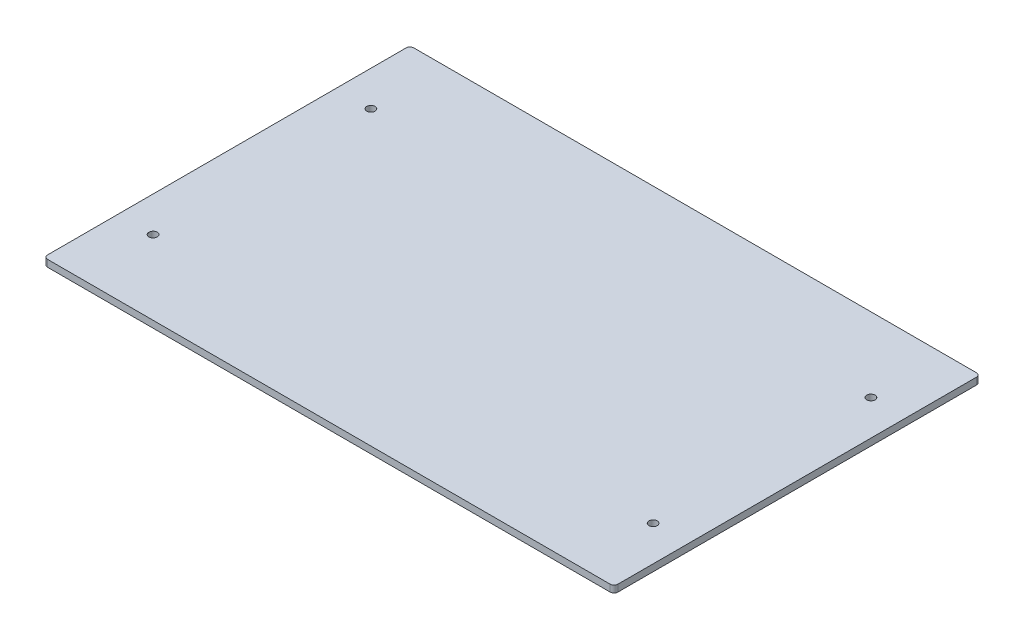
ISO-10303-21;
HEADER;
FILE_DESCRIPTION(('STEP AP214'),'2;1');
FILE_NAME('part.step','',(''),(''),'','','');
FILE_SCHEMA(('AUTOMOTIVE_DESIGN { 1 0 10303 214 1 1 1 1 }'));
ENDSEC;
DATA;
#1=APPLICATION_CONTEXT('core data for automotive mechanical design processes');
#2=APPLICATION_PROTOCOL_DEFINITION('international standard','automotive_design',2000,#1);
#3=PRODUCT_CONTEXT('',#1,'mechanical');
#4=PRODUCT('Part','Part','',(#3));
#5=PRODUCT_RELATED_PRODUCT_CATEGORY('part','',(#4));
#6=PRODUCT_DEFINITION_FORMATION('','',#4);
#7=PRODUCT_DEFINITION_CONTEXT('part definition',#1,'design');
#8=PRODUCT_DEFINITION('design','',#6,#7);
#9=PRODUCT_DEFINITION_SHAPE('','',#8);
#10=(LENGTH_UNIT() NAMED_UNIT(*) SI_UNIT(.MILLI.,.METRE.));
#11=(NAMED_UNIT(*) PLANE_ANGLE_UNIT() SI_UNIT($,.RADIAN.));
#12=(NAMED_UNIT(*) SI_UNIT($,.STERADIAN.) SOLID_ANGLE_UNIT());
#13=UNCERTAINTY_MEASURE_WITH_UNIT(LENGTH_MEASURE(1.E-05),#10,'distance_accuracy_value','');
#14=(GEOMETRIC_REPRESENTATION_CONTEXT(3) GLOBAL_UNCERTAINTY_ASSIGNED_CONTEXT((#13)) GLOBAL_UNIT_ASSIGNED_CONTEXT((#10,
#11,#12)) REPRESENTATION_CONTEXT('',''));
#15=CARTESIAN_POINT('',(0.,0.,0.));
#16=DIRECTION('',(0.,0.,1.));
#17=DIRECTION('',(1.,0.,0.));
#18=AXIS2_PLACEMENT_3D('',#15,#16,#17);
#19=CARTESIAN_POINT('',(0.,5.588,0.));
#20=DIRECTION('',(0.,-1.,0.));
#21=DIRECTION('',(0.,0.,-1.));
#22=AXIS2_PLACEMENT_3D('',#19,#20,#21);
#23=PLANE('',#22);
#24=DIRECTION('',(-1.,0.,0.));
#25=VECTOR('',#24,1.);
#26=CARTESIAN_POINT('',(0.,5.588,-297.688));
#27=LINE('',#26,#25);
#28=CARTESIAN_POINT('',(460.375,5.588,-297.688));
#29=VERTEX_POINT('',#28);
#30=CARTESIAN_POINT('',(3.175,5.588,-297.688));
#31=VERTEX_POINT('',#30);
#32=EDGE_CURVE('E138',#29,#31,#27,.T.);
#33=ORIENTED_EDGE('',*,*,#32,.T.);
#34=CARTESIAN_POINT('',(3.175,5.588,-294.513));
#35=DIRECTION('',(0.,-1.,0.));
#36=DIRECTION('',(0.,0.,-1.));
#37=AXIS2_PLACEMENT_3D('',#34,#35,#36);
#38=CIRCLE('',#37,3.175);
#39=CARTESIAN_POINT('',(0.,5.588,-294.513));
#40=VERTEX_POINT('',#39);
#41=EDGE_CURVE('E156',#31,#40,#38,.F.);
#42=ORIENTED_EDGE('',*,*,#41,.T.);
#43=DIRECTION('',(0.,0.,1.));
#44=VECTOR('',#43,1.);
#45=CARTESIAN_POINT('',(0.,5.588,0.));
#46=LINE('',#45,#44);
#47=CARTESIAN_POINT('',(0.,5.588,-3.175));
#48=VERTEX_POINT('',#47);
#49=EDGE_CURVE('E120',#40,#48,#46,.T.);
#50=ORIENTED_EDGE('',*,*,#49,.T.);
#51=CARTESIAN_POINT('',(3.175,5.588,-3.175));
#52=DIRECTION('',(0.,-1.,0.));
#53=DIRECTION('',(0.,0.,-1.));
#54=AXIS2_PLACEMENT_3D('',#51,#52,#53);
#55=CIRCLE('',#54,3.175);
#56=CARTESIAN_POINT('',(3.175,5.588,0.));
#57=VERTEX_POINT('',#56);
#58=EDGE_CURVE('E152',#48,#57,#55,.F.);
#59=ORIENTED_EDGE('',*,*,#58,.T.);
#60=DIRECTION('',(1.,0.,0.));
#61=VECTOR('',#60,1.);
#62=CARTESIAN_POINT('',(0.,5.588,0.));
#63=LINE('',#62,#61);
#64=CARTESIAN_POINT('',(460.375,5.588,0.));
#65=VERTEX_POINT('',#64);
#66=EDGE_CURVE('E165',#57,#65,#63,.T.);
#67=ORIENTED_EDGE('',*,*,#66,.T.);
#68=CARTESIAN_POINT('',(460.375,5.588,-3.175));
#69=DIRECTION('',(0.,-1.,0.));
#70=DIRECTION('',(0.,0.,-1.));
#71=AXIS2_PLACEMENT_3D('',#68,#69,#70);
#72=CIRCLE('',#71,3.175);
#73=CARTESIAN_POINT('',(463.55,5.588,-3.175));
#74=VERTEX_POINT('',#73);
#75=EDGE_CURVE('E55',#65,#74,#72,.F.);
#76=ORIENTED_EDGE('',*,*,#75,.T.);
#77=DIRECTION('',(0.,0.,-1.));
#78=VECTOR('',#77,1.);
#79=CARTESIAN_POINT('',(463.55,5.588,0.));
#80=LINE('',#79,#78);
#81=CARTESIAN_POINT('',(463.55,5.588,-294.513));
#82=VERTEX_POINT('',#81);
#83=EDGE_CURVE('E171',#74,#82,#80,.T.);
#84=ORIENTED_EDGE('',*,*,#83,.T.);
#85=CARTESIAN_POINT('',(460.375,5.588,-294.513));
#86=DIRECTION('',(0.,-1.,0.));
#87=DIRECTION('',(0.,0.,-1.));
#88=AXIS2_PLACEMENT_3D('',#85,#86,#87);
#89=CIRCLE('',#88,3.175);
#90=EDGE_CURVE('E154',#82,#29,#89,.F.);
#91=ORIENTED_EDGE('',*,*,#90,.T.);
#92=EDGE_LOOP('',(#33,#42,#50,#59,#67,#76,#84,#91));
#93=FACE_BOUND('',#92,.T.);
#94=CARTESIAN_POINT('',(28.575,5.588,-60.325));
#95=DIRECTION('',(0.,1.,0.));
#96=DIRECTION('',(0.,0.,1.));
#97=AXIS2_PLACEMENT_3D('',#94,#95,#96);
#98=CIRCLE('',#97,3.37820000000001);
#99=CARTESIAN_POINT('',(28.575,5.588,-56.9468));
#100=VERTEX_POINT('',#99);
#101=EDGE_CURVE('E129',#100,#100,#98,.T.);
#102=ORIENTED_EDGE('',*,*,#101,.F.);
#103=EDGE_LOOP('',(#102));
#104=FACE_BOUND('',#103,.T.);
#105=CARTESIAN_POINT('',(28.575,5.588,-237.363));
#106=DIRECTION('',(0.,1.,0.));
#107=DIRECTION('',(0.,0.,1.));
#108=AXIS2_PLACEMENT_3D('',#105,#106,#107);
#109=CIRCLE('',#108,3.37819999999999);
#110=CARTESIAN_POINT('',(28.575,5.588,-233.9848));
#111=VERTEX_POINT('',#110);
#112=EDGE_CURVE('E186',#111,#111,#109,.T.);
#113=ORIENTED_EDGE('',*,*,#112,.F.);
#114=EDGE_LOOP('',(#113));
#115=FACE_BOUND('',#114,.T.);
#116=CARTESIAN_POINT('',(434.975,5.588,-237.363));
#117=DIRECTION('',(0.,1.,0.));
#118=DIRECTION('',(0.,0.,-1.));
#119=AXIS2_PLACEMENT_3D('',#116,#117,#118);
#120=CIRCLE('',#119,3.37819999999999);
#121=CARTESIAN_POINT('',(434.975,5.588,-240.7412));
#122=VERTEX_POINT('',#121);
#123=EDGE_CURVE('E191',#122,#122,#120,.T.);
#124=ORIENTED_EDGE('',*,*,#123,.F.);
#125=EDGE_LOOP('',(#124));
#126=FACE_BOUND('',#125,.T.);
#127=CARTESIAN_POINT('',(434.975,5.588,-60.325));
#128=DIRECTION('',(0.,1.,0.));
#129=DIRECTION('',(0.,0.,-1.));
#130=AXIS2_PLACEMENT_3D('',#127,#128,#129);
#131=CIRCLE('',#130,3.37819999999999);
#132=CARTESIAN_POINT('',(434.975,5.588,-63.7032));
#133=VERTEX_POINT('',#132);
#134=EDGE_CURVE('E197',#133,#133,#131,.T.);
#135=ORIENTED_EDGE('',*,*,#134,.F.);
#136=EDGE_LOOP('',(#135));
#137=FACE_BOUND('',#136,.T.);
#138=ADVANCED_FACE('F33',(#93,#104,#115,#126,#137),#23,.F.);
#139=CARTESIAN_POINT('',(0.,0.,0.));
#140=DIRECTION('',(0.,-1.,0.));
#141=DIRECTION('',(0.,0.,-1.));
#142=AXIS2_PLACEMENT_3D('',#139,#140,#141);
#143=PLANE('',#142);
#144=CARTESIAN_POINT('',(434.975,0.,-237.363));
#145=DIRECTION('',(0.,1.,0.));
#146=DIRECTION('',(0.,0.,-1.));
#147=AXIS2_PLACEMENT_3D('',#144,#145,#146);
#148=CIRCLE('',#147,3.37819999999999);
#149=CARTESIAN_POINT('',(434.975,0.,-240.7412));
#150=VERTEX_POINT('',#149);
#151=EDGE_CURVE('E194',#150,#150,#148,.T.);
#152=ORIENTED_EDGE('',*,*,#151,.T.);
#153=EDGE_LOOP('',(#152));
#154=FACE_BOUND('',#153,.T.);
#155=CARTESIAN_POINT('',(28.575,0.,-60.325));
#156=DIRECTION('',(0.,1.,0.));
#157=DIRECTION('',(0.,0.,1.));
#158=AXIS2_PLACEMENT_3D('',#155,#156,#157);
#159=CIRCLE('',#158,3.37820000000001);
#160=CARTESIAN_POINT('',(28.575,0.,-56.9468));
#161=VERTEX_POINT('',#160);
#162=EDGE_CURVE('E135',#161,#161,#159,.T.);
#163=ORIENTED_EDGE('',*,*,#162,.T.);
#164=EDGE_LOOP('',(#163));
#165=FACE_BOUND('',#164,.T.);
#166=DIRECTION('',(0.,0.,1.));
#167=VECTOR('',#166,1.);
#168=CARTESIAN_POINT('',(0.,0.,0.));
#169=LINE('',#168,#167);
#170=CARTESIAN_POINT('',(0.,0.,-294.513));
#171=VERTEX_POINT('',#170);
#172=CARTESIAN_POINT('',(0.,0.,-3.175));
#173=VERTEX_POINT('',#172);
#174=EDGE_CURVE('E117',#171,#173,#169,.T.);
#175=ORIENTED_EDGE('',*,*,#174,.F.);
#176=CARTESIAN_POINT('',(3.175,0.,-294.513));
#177=DIRECTION('',(0.,-1.,0.));
#178=DIRECTION('',(0.,0.,-1.));
#179=AXIS2_PLACEMENT_3D('',#176,#177,#178);
#180=CIRCLE('',#179,3.175);
#181=CARTESIAN_POINT('',(3.175,0.,-297.688));
#182=VERTEX_POINT('',#181);
#183=EDGE_CURVE('E100',#171,#182,#180,.T.);
#184=ORIENTED_EDGE('',*,*,#183,.T.);
#185=DIRECTION('',(-1.,0.,0.));
#186=VECTOR('',#185,1.);
#187=CARTESIAN_POINT('',(0.,0.,-297.688));
#188=LINE('',#187,#186);
#189=CARTESIAN_POINT('',(460.375,0.,-297.688));
#190=VERTEX_POINT('',#189);
#191=EDGE_CURVE('E142',#190,#182,#188,.T.);
#192=ORIENTED_EDGE('',*,*,#191,.F.);
#193=CARTESIAN_POINT('',(460.375,0.,-294.513));
#194=DIRECTION('',(0.,-1.,0.));
#195=DIRECTION('',(0.,0.,-1.));
#196=AXIS2_PLACEMENT_3D('',#193,#194,#195);
#197=CIRCLE('',#196,3.175);
#198=CARTESIAN_POINT('',(463.55,0.,-294.513));
#199=VERTEX_POINT('',#198);
#200=EDGE_CURVE('E111',#190,#199,#197,.T.);
#201=ORIENTED_EDGE('',*,*,#200,.T.);
#202=DIRECTION('',(0.,0.,-1.));
#203=VECTOR('',#202,1.);
#204=CARTESIAN_POINT('',(463.55,0.,0.));
#205=LINE('',#204,#203);
#206=CARTESIAN_POINT('',(463.55,0.,-3.175));
#207=VERTEX_POINT('',#206);
#208=EDGE_CURVE('E132',#207,#199,#205,.T.);
#209=ORIENTED_EDGE('',*,*,#208,.F.);
#210=CARTESIAN_POINT('',(460.375,0.,-3.175));
#211=DIRECTION('',(0.,-1.,0.));
#212=DIRECTION('',(0.,0.,-1.));
#213=AXIS2_PLACEMENT_3D('',#210,#211,#212);
#214=CIRCLE('',#213,3.175);
#215=CARTESIAN_POINT('',(460.375,0.,0.));
#216=VERTEX_POINT('',#215);
#217=EDGE_CURVE('E121',#207,#216,#214,.T.);
#218=ORIENTED_EDGE('',*,*,#217,.T.);
#219=DIRECTION('',(1.,0.,0.));
#220=VECTOR('',#219,1.);
#221=CARTESIAN_POINT('',(0.,0.,0.));
#222=LINE('',#221,#220);
#223=CARTESIAN_POINT('',(3.175,0.,0.));
#224=VERTEX_POINT('',#223);
#225=EDGE_CURVE('E128',#224,#216,#222,.T.);
#226=ORIENTED_EDGE('',*,*,#225,.F.);
#227=CARTESIAN_POINT('',(3.175,0.,-3.175));
#228=DIRECTION('',(0.,-1.,0.));
#229=DIRECTION('',(0.,0.,-1.));
#230=AXIS2_PLACEMENT_3D('',#227,#228,#229);
#231=CIRCLE('',#230,3.175);
#232=EDGE_CURVE('E127',#224,#173,#231,.T.);
#233=ORIENTED_EDGE('',*,*,#232,.T.);
#234=EDGE_LOOP('',(#175,#184,#192,#201,#209,#218,#226,#233));
#235=FACE_BOUND('',#234,.T.);
#236=CARTESIAN_POINT('',(28.575,0.,-237.363));
#237=DIRECTION('',(0.,1.,0.));
#238=DIRECTION('',(0.,0.,1.));
#239=AXIS2_PLACEMENT_3D('',#236,#237,#238);
#240=CIRCLE('',#239,3.37819999999999);
#241=CARTESIAN_POINT('',(28.575,0.,-233.9848));
#242=VERTEX_POINT('',#241);
#243=EDGE_CURVE('E188',#242,#242,#240,.T.);
#244=ORIENTED_EDGE('',*,*,#243,.T.);
#245=EDGE_LOOP('',(#244));
#246=FACE_BOUND('',#245,.T.);
#247=CARTESIAN_POINT('',(434.975,0.,-60.325));
#248=DIRECTION('',(0.,1.,0.));
#249=DIRECTION('',(0.,0.,-1.));
#250=AXIS2_PLACEMENT_3D('',#247,#248,#249);
#251=CIRCLE('',#250,3.37819999999999);
#252=CARTESIAN_POINT('',(434.975,0.,-63.7032));
#253=VERTEX_POINT('',#252);
#254=EDGE_CURVE('E200',#253,#253,#251,.T.);
#255=ORIENTED_EDGE('',*,*,#254,.T.);
#256=EDGE_LOOP('',(#255));
#257=FACE_BOUND('',#256,.T.);
#258=ADVANCED_FACE('F124',(#154,#165,#235,#246,#257),#143,.T.);
#259=CARTESIAN_POINT('',(0.,5.588,0.));
#260=DIRECTION('',(1.,0.,0.));
#261=DIRECTION('',(0.,0.,-1.));
#262=AXIS2_PLACEMENT_3D('',#259,#260,#261);
#263=PLANE('',#262);
#264=ORIENTED_EDGE('',*,*,#49,.F.);
#265=DIRECTION('',(0.,-1.,0.));
#266=VECTOR('',#265,1.);
#267=CARTESIAN_POINT('',(0.,5.588,-294.513));
#268=LINE('',#267,#266);
#269=EDGE_CURVE('E104',#40,#171,#268,.T.);
#270=ORIENTED_EDGE('',*,*,#269,.T.);
#271=ORIENTED_EDGE('',*,*,#174,.T.);
#272=DIRECTION('',(0.,-1.,0.));
#273=VECTOR('',#272,1.);
#274=CARTESIAN_POINT('',(0.,5.588,-3.175));
#275=LINE('',#274,#273);
#276=EDGE_CURVE('E122',#173,#48,#275,.F.);
#277=ORIENTED_EDGE('',*,*,#276,.T.);
#278=EDGE_LOOP('',(#264,#270,#271,#277));
#279=FACE_BOUND('',#278,.T.);
#280=ADVANCED_FACE('F116',(#279),#263,.F.);
#281=CARTESIAN_POINT('',(0.,5.588,0.));
#282=DIRECTION('',(0.,0.,-1.));
#283=DIRECTION('',(-1.,0.,0.));
#284=AXIS2_PLACEMENT_3D('',#281,#282,#283);
#285=PLANE('',#284);
#286=ORIENTED_EDGE('',*,*,#66,.F.);
#287=DIRECTION('',(0.,-1.,0.));
#288=VECTOR('',#287,1.);
#289=CARTESIAN_POINT('',(3.175,5.588,0.));
#290=LINE('',#289,#288);
#291=EDGE_CURVE('E11',#57,#224,#290,.T.);
#292=ORIENTED_EDGE('',*,*,#291,.T.);
#293=ORIENTED_EDGE('',*,*,#225,.T.);
#294=DIRECTION('',(0.,-1.,0.));
#295=VECTOR('',#294,1.);
#296=CARTESIAN_POINT('',(460.375,5.588,0.));
#297=LINE('',#296,#295);
#298=EDGE_CURVE('E41',#216,#65,#297,.F.);
#299=ORIENTED_EDGE('',*,*,#298,.T.);
#300=EDGE_LOOP('',(#286,#292,#293,#299));
#301=FACE_BOUND('',#300,.T.);
#302=ADVANCED_FACE('F164',(#301),#285,.F.);
#303=CARTESIAN_POINT('',(463.55,5.588,0.));
#304=DIRECTION('',(-1.,0.,0.));
#305=DIRECTION('',(0.,0.,1.));
#306=AXIS2_PLACEMENT_3D('',#303,#304,#305);
#307=PLANE('',#306);
#308=ORIENTED_EDGE('',*,*,#208,.T.);
#309=DIRECTION('',(0.,-1.,0.));
#310=VECTOR('',#309,1.);
#311=CARTESIAN_POINT('',(463.55,5.588,-294.513));
#312=LINE('',#311,#310);
#313=EDGE_CURVE('E48',#199,#82,#312,.F.);
#314=ORIENTED_EDGE('',*,*,#313,.T.);
#315=ORIENTED_EDGE('',*,*,#83,.F.);
#316=DIRECTION('',(0.,-1.,0.));
#317=VECTOR('',#316,1.);
#318=CARTESIAN_POINT('',(463.55,5.588,-3.175));
#319=LINE('',#318,#317);
#320=EDGE_CURVE('E158',#74,#207,#319,.T.);
#321=ORIENTED_EDGE('',*,*,#320,.T.);
#322=EDGE_LOOP('',(#308,#314,#315,#321));
#323=FACE_BOUND('',#322,.T.);
#324=ADVANCED_FACE('F175',(#323),#307,.F.);
#325=CARTESIAN_POINT('',(0.,5.588,-297.688));
#326=DIRECTION('',(0.,0.,1.));
#327=DIRECTION('',(1.,0.,0.));
#328=AXIS2_PLACEMENT_3D('',#325,#326,#327);
#329=PLANE('',#328);
#330=ORIENTED_EDGE('',*,*,#191,.T.);
#331=DIRECTION('',(0.,-1.,0.));
#332=VECTOR('',#331,1.);
#333=CARTESIAN_POINT('',(3.175,5.588,-297.688));
#334=LINE('',#333,#332);
#335=EDGE_CURVE('E105',#182,#31,#334,.F.);
#336=ORIENTED_EDGE('',*,*,#335,.T.);
#337=ORIENTED_EDGE('',*,*,#32,.F.);
#338=DIRECTION('',(0.,-1.,0.));
#339=VECTOR('',#338,1.);
#340=CARTESIAN_POINT('',(460.375,5.588,-297.688));
#341=LINE('',#340,#339);
#342=EDGE_CURVE('E110',#29,#190,#341,.T.);
#343=ORIENTED_EDGE('',*,*,#342,.T.);
#344=EDGE_LOOP('',(#330,#336,#337,#343));
#345=FACE_BOUND('',#344,.T.);
#346=ADVANCED_FACE('F182',(#345),#329,.F.);
#347=CARTESIAN_POINT('',(28.575,5.588,-60.325));
#348=DIRECTION('',(0.,-1.,0.));
#349=DIRECTION('',(0.,0.,-1.));
#350=AXIS2_PLACEMENT_3D('',#347,#348,#349);
#351=CYLINDRICAL_SURFACE('',#350,3.37820000000001);
#352=ORIENTED_EDGE('',*,*,#101,.T.);
#353=EDGE_LOOP('',(#352));
#354=FACE_BOUND('',#353,.T.);
#355=ORIENTED_EDGE('',*,*,#162,.F.);
#356=EDGE_LOOP('',(#355));
#357=FACE_BOUND('',#356,.T.);
#358=ADVANCED_FACE('F217',(#354,#357),#351,.F.);
#359=CARTESIAN_POINT('',(28.575,5.588,-237.363));
#360=DIRECTION('',(0.,-1.,0.));
#361=DIRECTION('',(0.,0.,-1.));
#362=AXIS2_PLACEMENT_3D('',#359,#360,#361);
#363=CYLINDRICAL_SURFACE('',#362,3.37819999999999);
#364=ORIENTED_EDGE('',*,*,#112,.T.);
#365=EDGE_LOOP('',(#364));
#366=FACE_BOUND('',#365,.T.);
#367=ORIENTED_EDGE('',*,*,#243,.F.);
#368=EDGE_LOOP('',(#367));
#369=FACE_BOUND('',#368,.T.);
#370=ADVANCED_FACE('F309',(#366,#369),#363,.F.);
#371=CARTESIAN_POINT('',(434.975,5.588,-237.363));
#372=DIRECTION('',(0.,-1.,0.));
#373=DIRECTION('',(0.,0.,-1.));
#374=AXIS2_PLACEMENT_3D('',#371,#372,#373);
#375=CYLINDRICAL_SURFACE('',#374,3.37819999999999);
#376=ORIENTED_EDGE('',*,*,#123,.T.);
#377=EDGE_LOOP('',(#376));
#378=FACE_BOUND('',#377,.T.);
#379=ORIENTED_EDGE('',*,*,#151,.F.);
#380=EDGE_LOOP('',(#379));
#381=FACE_BOUND('',#380,.T.);
#382=ADVANCED_FACE('F300',(#378,#381),#375,.F.);
#383=CARTESIAN_POINT('',(434.975,5.588,-60.325));
#384=DIRECTION('',(0.,-1.,0.));
#385=DIRECTION('',(0.,0.,-1.));
#386=AXIS2_PLACEMENT_3D('',#383,#384,#385);
#387=CYLINDRICAL_SURFACE('',#386,3.37819999999999);
#388=ORIENTED_EDGE('',*,*,#134,.T.);
#389=EDGE_LOOP('',(#388));
#390=FACE_BOUND('',#389,.T.);
#391=ORIENTED_EDGE('',*,*,#254,.F.);
#392=EDGE_LOOP('',(#391));
#393=FACE_BOUND('',#392,.T.);
#394=ADVANCED_FACE('F206',(#390,#393),#387,.F.);
#395=CARTESIAN_POINT('',(3.175,5.588,-294.513));
#396=DIRECTION('',(0.,-1.,0.));
#397=DIRECTION('',(0.,0.,-1.));
#398=AXIS2_PLACEMENT_3D('',#395,#396,#397);
#399=CYLINDRICAL_SURFACE('',#398,3.175);
#400=ORIENTED_EDGE('',*,*,#41,.F.);
#401=ORIENTED_EDGE('',*,*,#335,.F.);
#402=ORIENTED_EDGE('',*,*,#183,.F.);
#403=ORIENTED_EDGE('',*,*,#269,.F.);
#404=EDGE_LOOP('',(#400,#401,#402,#403));
#405=FACE_BOUND('',#404,.T.);
#406=ADVANCED_FACE('F103',(#405),#399,.T.);
#407=CARTESIAN_POINT('',(460.375,5.588,-294.513));
#408=DIRECTION('',(0.,-1.,0.));
#409=DIRECTION('',(0.,0.,-1.));
#410=AXIS2_PLACEMENT_3D('',#407,#408,#409);
#411=CYLINDRICAL_SURFACE('',#410,3.175);
#412=ORIENTED_EDGE('',*,*,#90,.F.);
#413=ORIENTED_EDGE('',*,*,#313,.F.);
#414=ORIENTED_EDGE('',*,*,#200,.F.);
#415=ORIENTED_EDGE('',*,*,#342,.F.);
#416=EDGE_LOOP('',(#412,#413,#414,#415));
#417=FACE_BOUND('',#416,.T.);
#418=ADVANCED_FACE('F179',(#417),#411,.T.);
#419=CARTESIAN_POINT('',(3.175,5.588,-3.175));
#420=DIRECTION('',(0.,-1.,0.));
#421=DIRECTION('',(0.,0.,-1.));
#422=AXIS2_PLACEMENT_3D('',#419,#420,#421);
#423=CYLINDRICAL_SURFACE('',#422,3.175);
#424=ORIENTED_EDGE('',*,*,#58,.F.);
#425=ORIENTED_EDGE('',*,*,#276,.F.);
#426=ORIENTED_EDGE('',*,*,#232,.F.);
#427=ORIENTED_EDGE('',*,*,#291,.F.);
#428=EDGE_LOOP('',(#424,#425,#426,#427));
#429=FACE_BOUND('',#428,.T.);
#430=ADVANCED_FACE('F231',(#429),#423,.T.);
#431=CARTESIAN_POINT('',(460.375,5.588,-3.175));
#432=DIRECTION('',(0.,-1.,0.));
#433=DIRECTION('',(0.,0.,-1.));
#434=AXIS2_PLACEMENT_3D('',#431,#432,#433);
#435=CYLINDRICAL_SURFACE('',#434,3.175);
#436=ORIENTED_EDGE('',*,*,#75,.F.);
#437=ORIENTED_EDGE('',*,*,#298,.F.);
#438=ORIENTED_EDGE('',*,*,#217,.F.);
#439=ORIENTED_EDGE('',*,*,#320,.F.);
#440=EDGE_LOOP('',(#436,#437,#438,#439));
#441=FACE_BOUND('',#440,.T.);
#442=ADVANCED_FACE('F35',(#441),#435,.T.);
#443=CLOSED_SHELL('',(#138,#258,#280,#302,#324,#346,#358,#370,#382,#394,#406,#418,#430,#442));
#444=MANIFOLD_SOLID_BREP('B2',#443);
#445=ADVANCED_BREP_SHAPE_REPRESENTATION('',(#18,#444),#14);
#446=SHAPE_DEFINITION_REPRESENTATION(#9,#445);
ENDSEC;
END-ISO-10303-21;
